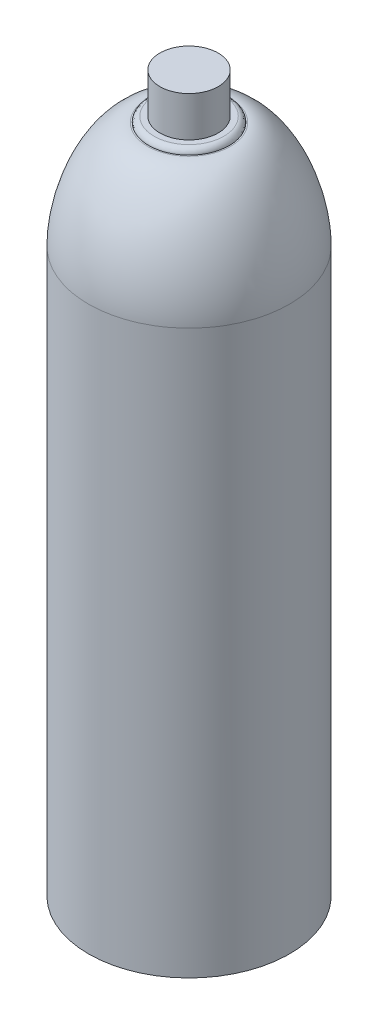
ISO-10303-21;
HEADER;
FILE_DESCRIPTION(('STEP AP214'),'2;1');
FILE_NAME('part.step','',(''),(''),'','','');
FILE_SCHEMA(('AUTOMOTIVE_DESIGN { 1 0 10303 214 1 1 1 1 }'));
ENDSEC;
DATA;
#1=APPLICATION_CONTEXT('core data for automotive mechanical design processes');
#2=APPLICATION_PROTOCOL_DEFINITION('international standard','automotive_design',2000,#1);
#3=PRODUCT_CONTEXT('',#1,'mechanical');
#4=PRODUCT('Part','Part','',(#3));
#5=PRODUCT_RELATED_PRODUCT_CATEGORY('part','',(#4));
#6=PRODUCT_DEFINITION_FORMATION('','',#4);
#7=PRODUCT_DEFINITION_CONTEXT('part definition',#1,'design');
#8=PRODUCT_DEFINITION('design','',#6,#7);
#9=PRODUCT_DEFINITION_SHAPE('','',#8);
#10=(LENGTH_UNIT() NAMED_UNIT(*) SI_UNIT(.MILLI.,.METRE.));
#11=(NAMED_UNIT(*) PLANE_ANGLE_UNIT() SI_UNIT($,.RADIAN.));
#12=(NAMED_UNIT(*) SI_UNIT($,.STERADIAN.) SOLID_ANGLE_UNIT());
#13=UNCERTAINTY_MEASURE_WITH_UNIT(LENGTH_MEASURE(1.E-05),#10,'distance_accuracy_value','');
#14=(GEOMETRIC_REPRESENTATION_CONTEXT(3) GLOBAL_UNCERTAINTY_ASSIGNED_CONTEXT((#13)) GLOBAL_UNIT_ASSIGNED_CONTEXT((#10,
#11,#12)) REPRESENTATION_CONTEXT('',''));
#15=CARTESIAN_POINT('',(0.,0.,0.));
#16=DIRECTION('',(0.,0.,1.));
#17=DIRECTION('',(1.,0.,0.));
#18=AXIS2_PLACEMENT_3D('',#15,#16,#17);
#19=CARTESIAN_POINT('',(0.,250.,0.));
#20=DIRECTION('',(0.,-1.,0.));
#21=DIRECTION('',(0.,0.,-1.));
#22=AXIS2_PLACEMENT_3D('',#19,#20,#21);
#23=CYLINDRICAL_SURFACE('',#22,37.5);
#24=CARTESIAN_POINT('',(0.,210.,37.5));
#25=CARTESIAN_POINT('',(4.90873851782908,210.,37.5));
#26=CARTESIAN_POINT('',(9.81554566661643,210.,36.5239753737598));
#27=CARTESIAN_POINT('',(18.8857117607653,210.,32.7669895645867));
#28=CARTESIAN_POINT('',(23.0455020014685,210.,29.9875065875226));
#29=CARTESIAN_POINT('',(29.9875065875226,210.,23.0455020014685));
#30=CARTESIAN_POINT('',(32.7669895645878,210.,18.8857117607628));
#31=CARTESIAN_POINT('',(36.5239753737588,210.,9.8155456666189));
#32=CARTESIAN_POINT('',(37.5,210.,4.90873851782876));
#33=CARTESIAN_POINT('',(37.5,210.,-4.90873851782875));
#34=CARTESIAN_POINT('',(36.5239753737571,210.,-9.81554566662292));
#35=CARTESIAN_POINT('',(32.7669895645894,210.,-18.8857117607588));
#36=CARTESIAN_POINT('',(29.9875065875247,210.,-23.0455020014663));
#37=CARTESIAN_POINT('',(23.0455020014663,210.,-29.9875065875248));
#38=CARTESIAN_POINT('',(18.8857117607618,210.,-32.7669895645882));
#39=CARTESIAN_POINT('',(9.81554566662007,210.,-36.5239753737583));
#40=CARTESIAN_POINT('',(4.90873851782876,210.,-37.5));
#41=CARTESIAN_POINT('',(-4.90873851782875,210.,-37.5));
#42=CARTESIAN_POINT('',(-9.81554566662147,210.,-36.5239753737577));
#43=CARTESIAN_POINT('',(-18.8857117607602,210.,-32.7669895645889));
#44=CARTESIAN_POINT('',(-23.0455020014681,210.,-29.987506587523));
#45=CARTESIAN_POINT('',(-29.987506587523,210.,-23.0455020014681));
#46=CARTESIAN_POINT('',(-32.7669895645885,210.,-18.885711760761));
#47=CARTESIAN_POINT('',(-36.523975373758,210.,-9.81554566662087));
#48=CARTESIAN_POINT('',(-37.5,210.,-4.9087385178287));
#49=CARTESIAN_POINT('',(-37.5,210.,4.90873851782882));
#50=CARTESIAN_POINT('',(-36.5239753737567,210.,9.81554566662376));
#51=CARTESIAN_POINT('',(-32.7669895645898,210.,18.8857117607579));
#52=CARTESIAN_POINT('',(-29.9875065875223,210.,23.0455020014688));
#53=CARTESIAN_POINT('',(-23.0455020014689,210.,29.9875065875222));
#54=CARTESIAN_POINT('',(-18.8857117607595,210.,32.7669895645891));
#55=CARTESIAN_POINT('',(-9.81554566662237,210.,36.5239753737573));
#56=CARTESIAN_POINT('',(-4.90873851782909,210.,37.5));
#57=CARTESIAN_POINT('',(0.,210.,37.5));
#58=(BOUNDED_CURVE() B_SPLINE_CURVE(3,(#24,#25,#26,#27,#28,#29,#30,#31,#32,#33,#34,#35,#36,#37,
#38,#39,#40,#41,#42,#43,#44,#45,#46,#47,#48,#49,#50,#51,#52,#53,#54,#55,#56,#57),.UNSPECIFIED.,
.T.,.F.) B_SPLINE_CURVE_WITH_KNOTS((4,2,2,2,2,2,2,2,2,2,2,2,2,2,2,2,4),(0.,0.392699081698724,
0.785398163397448,1.17809724509617,1.5707963267949,1.96349540849362,2.35619449019234,
2.74889357189107,3.14159265358979,3.53429173528852,3.92699081698724,4.31968989868597,
4.71238898038469,5.10508806208341,5.49778714378214,5.89048622548086,6.28318530717959),
.UNSPECIFIED.) CURVE() GEOMETRIC_REPRESENTATION_ITEM() RATIONAL_B_SPLINE_CURVE((1.,1.,1.,1.,1.,
1.,1.,1.,1.,1.,1.,1.,1.,1.,1.,1.,1.,1.,1.,1.,1.,1.,1.,1.,1.,1.,1.,1.,1.,1.,1.,1.,1.,1.)) REPRESENTATION_ITEM(''));
#59=CARTESIAN_POINT('',(0.,210.,37.5));
#60=VERTEX_POINT('',#59);
#61=EDGE_CURVE('E56',#60,#60,#58,.F.);
#62=ORIENTED_EDGE('',*,*,#61,.T.);
#63=EDGE_LOOP('',(#62));
#64=FACE_BOUND('',#63,.T.);
#65=CARTESIAN_POINT('',(0.,0.,0.));
#66=DIRECTION('',(0.,1.,0.));
#67=DIRECTION('',(0.,0.,1.));
#68=AXIS2_PLACEMENT_3D('',#65,#66,#67);
#69=CIRCLE('',#68,37.5);
#70=CARTESIAN_POINT('',(0.,0.,37.5));
#71=VERTEX_POINT('',#70);
#72=EDGE_CURVE('E71',#71,#71,#69,.T.);
#73=ORIENTED_EDGE('',*,*,#72,.T.);
#74=EDGE_LOOP('',(#73));
#75=FACE_BOUND('',#74,.T.);
#76=ADVANCED_FACE('F42',(#64,#75),#23,.T.);
#77=CARTESIAN_POINT('',(0.,250.,0.));
#78=DIRECTION('',(0.,1.,0.));
#79=DIRECTION('',(0.,0.,1.));
#80=AXIS2_PLACEMENT_3D('',#77,#78,#79);
#81=PLANE('',#80);
#82=CARTESIAN_POINT('',(0.,250.,15.5));
#83=CARTESIAN_POINT('',(-2.02894525403602,250.,15.5));
#84=CARTESIAN_POINT('',(-4.05709220886935,250.,15.0965764878189));
#85=CARTESIAN_POINT('',(-7.80609419444848,250.,13.543689020031));
#86=CARTESIAN_POINT('',(-9.52547416060783,250.,12.3948360561752));
#87=CARTESIAN_POINT('',(-12.3948360561752,250.,9.52547416060777));
#88=CARTESIAN_POINT('',(-13.5436890200293,250.,7.80609419444756));
#89=CARTESIAN_POINT('',(-15.0965764878207,250.,4.05709220887018));
#90=CARTESIAN_POINT('',(-15.5,250.,2.02894525403591));
#91=CARTESIAN_POINT('',(-15.5,250.,-2.02894525403586));
#92=CARTESIAN_POINT('',(-15.0965764878206,250.,-4.05709220886935));
#93=CARTESIAN_POINT('',(-13.5436890200292,250.,-7.80609419444848));
#94=CARTESIAN_POINT('',(-12.3948360561759,250.,-9.52547416060711));
#95=CARTESIAN_POINT('',(-9.52547416060712,250.,-12.3948360561759));
#96=CARTESIAN_POINT('',(-7.80609419444786,250.,-13.5436890200293));
#97=CARTESIAN_POINT('',(-4.05709220886989,250.,-15.0965764878206));
#98=CARTESIAN_POINT('',(-2.02894525403588,250.,-15.5));
#99=CARTESIAN_POINT('',(2.02894525403589,250.,-15.5));
#100=CARTESIAN_POINT('',(4.05709220886905,250.,-15.0965764878206));
#101=CARTESIAN_POINT('',(7.80609419444878,250.,-13.5436890200293));
#102=CARTESIAN_POINT('',(9.52547416060711,250.,-12.3948360561776));
#103=CARTESIAN_POINT('',(12.3948360561759,250.,-9.52547416060537));
#104=CARTESIAN_POINT('',(13.5436890200302,250.,-7.80609419444817));
#105=CARTESIAN_POINT('',(15.0965764878197,250.,-4.05709220886962));
#106=CARTESIAN_POINT('',(15.5,250.,-2.02894525403588));
#107=CARTESIAN_POINT('',(15.5,250.,2.02894525403589));
#108=CARTESIAN_POINT('',(15.0965764878215,250.,4.05709220886961));
#109=CARTESIAN_POINT('',(13.5436890200284,250.,7.80609419444816));
#110=CARTESIAN_POINT('',(12.3948360561755,250.,9.52547416060746));
#111=CARTESIAN_POINT('',(9.52547416060746,250.,12.3948360561755));
#112=CARTESIAN_POINT('',(7.80609419444905,250.,13.5436890200284));
#113=CARTESIAN_POINT('',(4.05709220886874,250.,15.0965764878215));
#114=CARTESIAN_POINT('',(2.02894525403602,250.,15.5));
#115=CARTESIAN_POINT('',(0.,250.,15.5));
#116=(BOUNDED_CURVE() B_SPLINE_CURVE(3,(#82,#83,#84,#85,#86,#87,#88,#89,#90,#91,#92,#93,#94,#95,
#96,#97,#98,#99,#100,#101,#102,#103,#104,#105,#106,#107,#108,#109,#110,#111,#112,#113,#114,
#115),.UNSPECIFIED.,.T.,.F.) B_SPLINE_CURVE_WITH_KNOTS((4,2,2,2,2,2,2,2,2,2,2,2,2,2,2,2,4),(0.,
0.392699081698725,0.785398163397448,1.17809724509617,1.5707963267949,1.96349540849362,
2.35619449019234,2.74889357189107,3.14159265358979,3.53429173528852,3.92699081698724,
4.31968989868597,4.71238898038469,5.10508806208341,5.49778714378214,5.89048622548086,
6.28318530717959),
.UNSPECIFIED.) CURVE() GEOMETRIC_REPRESENTATION_ITEM() RATIONAL_B_SPLINE_CURVE((1.,1.,1.,1.,1.,
1.,1.,1.,1.,1.,1.,1.,1.,1.,1.,1.,1.,1.,1.,1.,1.,1.,1.,1.,1.,1.,1.,1.,1.,1.,1.,1.,1.,1.)) REPRESENTATION_ITEM(''));
#117=CARTESIAN_POINT('',(0.,250.,15.5));
#118=VERTEX_POINT('',#117);
#119=EDGE_CURVE('E61',#118,#118,#116,.F.);
#120=ORIENTED_EDGE('',*,*,#119,.T.);
#121=EDGE_LOOP('',(#120));
#122=FACE_BOUND('',#121,.T.);
#123=CARTESIAN_POINT('',(0.,250.,15.));
#124=CARTESIAN_POINT('',(1.9634954065633,250.,15.));
#125=CARTESIAN_POINT('',(3.92621826717784,250.,14.6095901492839));
#126=CARTESIAN_POINT('',(7.55428470377486,250.,13.1067958260547));
#127=CARTESIAN_POINT('',(9.21820080099195,250.,11.9950026346045));
#128=CARTESIAN_POINT('',(11.9950026346045,250.,9.21820080099195));
#129=CARTESIAN_POINT('',(13.1067958260547,250.,7.55428470377496));
#130=CARTESIAN_POINT('',(14.6095901492839,250.,3.92621826717772));
#131=CARTESIAN_POINT('',(15.,250.,1.96349540655724));
#132=CARTESIAN_POINT('',(15.,250.,-1.96349540655723));
#133=CARTESIAN_POINT('',(14.6095901492839,250.,-3.92621826717784));
#134=CARTESIAN_POINT('',(13.1067958260547,250.,-7.55428470377486));
#135=CARTESIAN_POINT('',(11.9950026346055,250.,-9.2182008009909));
#136=CARTESIAN_POINT('',(9.21820080099088,250.,-11.9950026346055));
#137=CARTESIAN_POINT('',(7.55428470377403,250.,-13.1067958260551));
#138=CARTESIAN_POINT('',(3.92621826717871,250.,-14.6095901492835));
#139=CARTESIAN_POINT('',(1.96349540655724,250.,-15.));
#140=CARTESIAN_POINT('',(-1.96349540655723,250.,-15.));
#141=CARTESIAN_POINT('',(-3.92621826717803,250.,-14.6095901492838));
#142=CARTESIAN_POINT('',(-7.55428470377462,250.,-13.1067958260548));
#143=CARTESIAN_POINT('',(-9.21820080099237,250.,-11.9950026346041));
#144=CARTESIAN_POINT('',(-11.9950026346041,250.,-9.21820080099236));
#145=CARTESIAN_POINT('',(-13.1067958260548,250.,-7.55428470377467));
#146=CARTESIAN_POINT('',(-14.6095901492838,250.,-3.92621826717806));
#147=CARTESIAN_POINT('',(-15.,250.,-1.96349540655721));
#148=CARTESIAN_POINT('',(-15.,250.,1.96349540655726));
#149=CARTESIAN_POINT('',(-14.609590149284,250.,3.9262182671776));
#150=CARTESIAN_POINT('',(-13.1067958260547,250.,7.55428470377505));
#151=CARTESIAN_POINT('',(-11.995002634602,250.,9.21820080099444));
#152=CARTESIAN_POINT('',(-9.21820080099451,250.,11.9950026346019));
#153=CARTESIAN_POINT('',(-7.55428470377405,250.,13.1067958260551));
#154=CARTESIAN_POINT('',(-3.92621826717869,250.,14.6095901492835));
#155=CARTESIAN_POINT('',(-1.96349540656331,250.,15.));
#156=CARTESIAN_POINT('',(0.,250.,15.));
#157=(BOUNDED_CURVE() B_SPLINE_CURVE(3,(#123,#124,#125,#126,#127,#128,#129,#130,#131,#132,#133,
#134,#135,#136,#137,#138,#139,#140,#141,#142,#143,#144,#145,#146,#147,#148,#149,#150,#151,#152,
#153,#154,#155,#156),.UNSPECIFIED.,.T.,.F.) B_SPLINE_CURVE_WITH_KNOTS((4,2,2,2,2,2,2,2,2,2,2,2,
2,2,2,2,4),(0.,0.392699081698724,0.785398163397448,1.17809724509617,1.5707963267949,
1.96349540849362,2.35619449019234,2.74889357189107,3.14159265358979,3.53429173528852,
3.92699081698724,4.31968989868597,4.71238898038469,5.10508806208341,5.49778714378214,
5.89048622548086,6.28318530717959),
.UNSPECIFIED.) CURVE() GEOMETRIC_REPRESENTATION_ITEM() RATIONAL_B_SPLINE_CURVE((1.,1.,1.,1.,1.,
1.,1.,1.,1.,1.,1.,1.,1.,1.,1.,1.,1.,1.,1.,1.,1.,1.,1.,1.,1.,1.,1.,1.,1.,1.,1.,1.,1.,1.)) REPRESENTATION_ITEM(''));
#158=CARTESIAN_POINT('',(0.,250.,15.));
#159=VERTEX_POINT('',#158);
#160=EDGE_CURVE('E66',#159,#159,#157,.T.);
#161=ORIENTED_EDGE('',*,*,#160,.F.);
#162=EDGE_LOOP('',(#161));
#163=FACE_BOUND('',#162,.T.);
#164=ADVANCED_FACE('F88',(#122,#163),#81,.T.);
#165=CARTESIAN_POINT('',(0.,0.,0.));
#166=DIRECTION('',(0.,1.,0.));
#167=DIRECTION('',(0.,0.,1.));
#168=AXIS2_PLACEMENT_3D('',#165,#166,#167);
#169=PLANE('',#168);
#170=ORIENTED_EDGE('',*,*,#72,.F.);
#171=EDGE_LOOP('',(#170));
#172=FACE_BOUND('',#171,.T.);
#173=ADVANCED_FACE('F98',(#172),#169,.F.);
#174=CARTESIAN_POINT('',(0.,252.,0.));
#175=DIRECTION('',(0.,1.,0.));
#176=DIRECTION('',(0.,0.,1.));
#177=AXIS2_PLACEMENT_3D('',#174,#175,#176);
#178=PLANE('',#177);
#179=CARTESIAN_POINT('',(0.,252.,13.));
#180=CARTESIAN_POINT('',(-1.70169601902153,252.,13.0000000000015));
#181=CARTESIAN_POINT('',(-3.4027224982213,252.,12.6616447960449));
#182=CARTESIAN_POINT('',(-6.54704674327107,252.,11.3592230492486));
#183=CARTESIAN_POINT('',(-7.98910736086171,252.,10.3956689499885));
#184=CARTESIAN_POINT('',(-10.3956689499886,252.,7.98910736086166));
#185=CARTESIAN_POINT('',(-11.3592230492456,252.,6.54704674327103));
#186=CARTESIAN_POINT('',(-12.6616447960478,252.,3.40272249822126));
#187=CARTESIAN_POINT('',(-13.,252.,1.70169601901629));
#188=CARTESIAN_POINT('',(-13.,252.,-1.70169601901625));
#189=CARTESIAN_POINT('',(-12.6616447960449,252.,-3.40272249822056));
#190=CARTESIAN_POINT('',(-11.3592230492486,252.,-6.54704674327181));
#191=CARTESIAN_POINT('',(-10.3956689499896,252.,-7.98910736086064));
#192=CARTESIAN_POINT('',(-7.98910736086065,252.,-10.3956689499896));
#193=CARTESIAN_POINT('',(-6.54704674327126,252.,-11.3592230492478));
#194=CARTESIAN_POINT('',(-3.40272249822104,252.,-12.6616447960457));
#195=CARTESIAN_POINT('',(-1.70169601901627,252.,-13.));
#196=CARTESIAN_POINT('',(1.70169601901627,252.,-13.));
#197=CARTESIAN_POINT('',(3.40272249822108,252.,-12.6616447960457));
#198=CARTESIAN_POINT('',(6.54704674327129,252.,-11.3592230492478));
#199=CARTESIAN_POINT('',(7.98910736085916,252.,-10.3956689499911));
#200=CARTESIAN_POINT('',(10.3956689499911,252.,-7.98910736085917));
#201=CARTESIAN_POINT('',(11.3592230492467,252.,-6.54704674327117));
#202=CARTESIAN_POINT('',(12.6616447960468,252.,-3.40272249822117));
#203=CARTESIAN_POINT('',(13.,252.,-1.70169601901627));
#204=CARTESIAN_POINT('',(13.,252.,1.70169601901627));
#205=CARTESIAN_POINT('',(12.6616447960453,252.,3.40272249822043));
#206=CARTESIAN_POINT('',(11.3592230492482,252.,6.5470467432719));
#207=CARTESIAN_POINT('',(10.3956689499906,252.,7.98910736085969));
#208=CARTESIAN_POINT('',(7.98910736085969,252.,10.3956689499906));
#209=CARTESIAN_POINT('',(6.54704674327117,252.,11.3592230492467));
#210=CARTESIAN_POINT('',(3.40272249822117,252.,12.6616447960468));
#211=CARTESIAN_POINT('',(1.70169601902153,252.,12.9999999999985));
#212=CARTESIAN_POINT('',(0.,252.,13.));
#213=(BOUNDED_CURVE() B_SPLINE_CURVE(3,(#179,#180,#181,#182,#183,#184,#185,#186,#187,#188,#189,
#190,#191,#192,#193,#194,#195,#196,#197,#198,#199,#200,#201,#202,#203,#204,#205,#206,#207,#208,
#209,#210,#211,#212),.UNSPECIFIED.,.T.,.F.) B_SPLINE_CURVE_WITH_KNOTS((4,2,2,2,2,2,2,2,2,2,2,2,
2,2,2,2,4),(0.,0.392699081698725,0.785398163397448,1.17809724509617,1.5707963267949,
1.96349540849362,2.35619449019234,2.74889357189107,3.14159265358979,3.53429173528852,
3.92699081698724,4.31968989868597,4.71238898038469,5.10508806208341,5.49778714378214,
5.89048622548086,6.28318530717959),
.UNSPECIFIED.) CURVE() GEOMETRIC_REPRESENTATION_ITEM() RATIONAL_B_SPLINE_CURVE((1.,1.,1.,1.,1.,
1.,1.,1.,1.,1.,1.,1.,1.,1.,1.,1.,1.,1.,1.,1.,1.,1.,1.,1.,1.,1.,1.,1.,1.,1.,1.,1.,1.,1.)) REPRESENTATION_ITEM(''));
#214=CARTESIAN_POINT('',(0.,252.,13.));
#215=VERTEX_POINT('',#214);
#216=EDGE_CURVE('E11',#215,#215,#213,.F.);
#217=ORIENTED_EDGE('',*,*,#216,.T.);
#218=EDGE_LOOP('',(#217));
#219=FACE_BOUND('',#218,.T.);
#220=CARTESIAN_POINT('',(0.,252.,0.));
#221=DIRECTION('',(0.,1.,0.));
#222=DIRECTION('',(0.,0.,1.));
#223=AXIS2_PLACEMENT_3D('',#220,#221,#222);
#224=CIRCLE('',#223,10.875);
#225=CARTESIAN_POINT('',(0.,252.,10.875));
#226=VERTEX_POINT('',#225);
#227=EDGE_CURVE('E76',#226,#226,#224,.F.);
#228=ORIENTED_EDGE('',*,*,#227,.T.);
#229=EDGE_LOOP('',(#228));
#230=FACE_BOUND('',#229,.T.);
#231=ADVANCED_FACE('F99',(#219,#230),#178,.T.);
#232=CARTESIAN_POINT('',(0.,267.,0.));
#233=DIRECTION('',(0.,-1.,0.));
#234=DIRECTION('',(0.,0.,-1.));
#235=AXIS2_PLACEMENT_3D('',#232,#233,#234);
#236=CYLINDRICAL_SURFACE('',#235,10.875);
#237=ORIENTED_EDGE('',*,*,#227,.F.);
#238=EDGE_LOOP('',(#237));
#239=FACE_BOUND('',#238,.T.);
#240=CARTESIAN_POINT('',(0.,267.,0.));
#241=DIRECTION('',(0.,1.,0.));
#242=DIRECTION('',(0.,0.,1.));
#243=AXIS2_PLACEMENT_3D('',#240,#241,#242);
#244=CIRCLE('',#243,10.875);
#245=CARTESIAN_POINT('',(0.,267.,10.875));
#246=VERTEX_POINT('',#245);
#247=EDGE_CURVE('E81',#246,#246,#244,.T.);
#248=ORIENTED_EDGE('',*,*,#247,.F.);
#249=EDGE_LOOP('',(#248));
#250=FACE_BOUND('',#249,.T.);
#251=ADVANCED_FACE('F175',(#239,#250),#236,.T.);
#252=CARTESIAN_POINT('',(0.,267.,0.));
#253=DIRECTION('',(0.,1.,0.));
#254=DIRECTION('',(0.,0.,1.));
#255=AXIS2_PLACEMENT_3D('',#252,#253,#254);
#256=PLANE('',#255);
#257=ORIENTED_EDGE('',*,*,#247,.T.);
#258=EDGE_LOOP('',(#257));
#259=FACE_BOUND('',#258,.T.);
#260=ADVANCED_FACE('F171',(#259),#256,.T.);
#261=CARTESIAN_POINT('',(0.,250.,15.5));
#262=CARTESIAN_POINT('',(2.02894525403602,250.,15.5));
#263=CARTESIAN_POINT('',(4.05709220886874,250.,15.0965764878215));
#264=CARTESIAN_POINT('',(7.80609419444905,250.,13.5436890200284));
#265=CARTESIAN_POINT('',(9.52547416060746,250.,12.3948360561755));
#266=CARTESIAN_POINT('',(12.3948360561755,250.,9.52547416060746));
#267=CARTESIAN_POINT('',(13.5436890200284,250.,7.80609419444816));
#268=CARTESIAN_POINT('',(15.0965764878215,250.,4.05709220886961));
#269=CARTESIAN_POINT('',(15.5,250.,2.02894525403589));
#270=CARTESIAN_POINT('',(15.5,250.,-2.02894525403588));
#271=CARTESIAN_POINT('',(15.0965764878197,250.,-4.05709220886962));
#272=CARTESIAN_POINT('',(13.5436890200302,250.,-7.80609419444817));
#273=CARTESIAN_POINT('',(12.3948360561759,250.,-9.52547416060537));
#274=CARTESIAN_POINT('',(9.52547416060711,250.,-12.3948360561776));
#275=CARTESIAN_POINT('',(7.80609419444878,250.,-13.5436890200293));
#276=CARTESIAN_POINT('',(4.05709220886905,250.,-15.0965764878206));
#277=CARTESIAN_POINT('',(2.02894525403589,250.,-15.5));
#278=CARTESIAN_POINT('',(-2.02894525403588,250.,-15.5));
#279=CARTESIAN_POINT('',(-4.05709220886989,250.,-15.0965764878206));
#280=CARTESIAN_POINT('',(-7.80609419444786,250.,-13.5436890200293));
#281=CARTESIAN_POINT('',(-9.52547416060712,250.,-12.3948360561759));
#282=CARTESIAN_POINT('',(-12.3948360561759,250.,-9.52547416060711));
#283=CARTESIAN_POINT('',(-13.5436890200292,250.,-7.80609419444848));
#284=CARTESIAN_POINT('',(-15.0965764878206,250.,-4.05709220886935));
#285=CARTESIAN_POINT('',(-15.5,250.,-2.02894525403586));
#286=CARTESIAN_POINT('',(-15.5,250.,2.02894525403591));
#287=CARTESIAN_POINT('',(-15.0965764878207,250.,4.05709220887018));
#288=CARTESIAN_POINT('',(-13.5436890200293,250.,7.80609419444756));
#289=CARTESIAN_POINT('',(-12.3948360561752,250.,9.52547416060777));
#290=CARTESIAN_POINT('',(-9.52547416060783,250.,12.3948360561752));
#291=CARTESIAN_POINT('',(-7.80609419444848,250.,13.543689020031));
#292=CARTESIAN_POINT('',(-4.05709220886935,250.,15.0965764878189));
#293=CARTESIAN_POINT('',(-2.02894525403602,250.,15.5));
#294=CARTESIAN_POINT('',(0.,250.,15.5));
#295=CARTESIAN_POINT('',(0.,250.,37.5));
#296=CARTESIAN_POINT('',(4.90873851782908,250.,37.5));
#297=CARTESIAN_POINT('',(9.81554566661408,250.,36.5239753737556));
#298=CARTESIAN_POINT('',(18.8857117607677,250.,32.7669895645909));
#299=CARTESIAN_POINT('',(23.0455020014649,250.,29.9875065875261));
#300=CARTESIAN_POINT('',(29.9875065875261,250.,23.0455020014649));
#301=CARTESIAN_POINT('',(32.7669895645909,250.,18.8857117607641));
#302=CARTESIAN_POINT('',(36.5239753737556,250.,9.81554566661759));
#303=CARTESIAN_POINT('',(37.5,250.,4.90873851782876));
#304=CARTESIAN_POINT('',(37.5,250.,-4.90873851782875));
#305=CARTESIAN_POINT('',(36.5239753737486,250.,-9.81554566661937));
#306=CARTESIAN_POINT('',(32.766989564598,250.,-18.8857117607624));
#307=CARTESIAN_POINT('',(29.9875065875247,250.,-23.0455020014663));
#308=CARTESIAN_POINT('',(23.0455020014663,250.,-29.9875065875248));
#309=CARTESIAN_POINT('',(18.8857117607644,250.,-32.7669895645833));
#310=CARTESIAN_POINT('',(9.81554566661742,250.,-36.5239753737632));
#311=CARTESIAN_POINT('',(4.90873851782876,250.,-37.5));
#312=CARTESIAN_POINT('',(-4.90873851782875,250.,-37.5));
#313=CARTESIAN_POINT('',(-9.81554566661908,250.,-36.5239753737491));
#314=CARTESIAN_POINT('',(-18.8857117607626,250.,-32.7669895645974));
#315=CARTESIAN_POINT('',(-23.0455020014699,250.,-29.9875065875247));
#316=CARTESIAN_POINT('',(-29.9875065875212,250.,-23.0455020014663));
#317=CARTESIAN_POINT('',(-32.7669895645915,250.,-18.8857117607587));
#318=CARTESIAN_POINT('',(-36.523975373755,250.,-9.81554566662316));
#319=CARTESIAN_POINT('',(-37.5,250.,-4.9087385178287));
#320=CARTESIAN_POINT('',(-37.5,250.,4.90873851782882));
#321=CARTESIAN_POINT('',(-36.523975373755,250.,9.81554566662305));
#322=CARTESIAN_POINT('',(-32.7669895645915,250.,18.8857117607586));
#323=CARTESIAN_POINT('',(-29.9875065875206,250.,23.0455020014705));
#324=CARTESIAN_POINT('',(-23.0455020014707,250.,29.9875065875204));
#325=CARTESIAN_POINT('',(-18.8857117607587,250.,32.7669895645915));
#326=CARTESIAN_POINT('',(-9.81554566662316,250.,36.523975373755));
#327=CARTESIAN_POINT('',(-4.90873851782909,250.,37.5));
#328=CARTESIAN_POINT('',(0.,250.,37.5));
#329=CARTESIAN_POINT('',(0.,210.,37.5));
#330=CARTESIAN_POINT('',(4.90873851782908,210.,37.5));
#331=CARTESIAN_POINT('',(9.81554566661643,210.,36.5239753737598));
#332=CARTESIAN_POINT('',(18.8857117607653,210.,32.7669895645867));
#333=CARTESIAN_POINT('',(23.0455020014685,210.,29.9875065875226));
#334=CARTESIAN_POINT('',(29.9875065875226,210.,23.0455020014685));
#335=CARTESIAN_POINT('',(32.7669895645878,210.,18.8857117607628));
#336=CARTESIAN_POINT('',(36.5239753737588,210.,9.8155456666189));
#337=CARTESIAN_POINT('',(37.5,210.,4.90873851782876));
#338=CARTESIAN_POINT('',(37.5,210.,-4.90873851782875));
#339=CARTESIAN_POINT('',(36.5239753737571,210.,-9.81554566662292));
#340=CARTESIAN_POINT('',(32.7669895645894,210.,-18.8857117607588));
#341=CARTESIAN_POINT('',(29.9875065875247,210.,-23.0455020014663));
#342=CARTESIAN_POINT('',(23.0455020014663,210.,-29.9875065875248));
#343=CARTESIAN_POINT('',(18.8857117607618,210.,-32.7669895645882));
#344=CARTESIAN_POINT('',(9.81554566662007,210.,-36.5239753737583));
#345=CARTESIAN_POINT('',(4.90873851782876,210.,-37.5));
#346=CARTESIAN_POINT('',(-4.90873851782875,210.,-37.5));
#347=CARTESIAN_POINT('',(-9.81554566662147,210.,-36.5239753737577));
#348=CARTESIAN_POINT('',(-18.8857117607602,210.,-32.7669895645889));
#349=CARTESIAN_POINT('',(-23.0455020014681,210.,-29.987506587523));
#350=CARTESIAN_POINT('',(-29.987506587523,210.,-23.0455020014681));
#351=CARTESIAN_POINT('',(-32.7669895645885,210.,-18.885711760761));
#352=CARTESIAN_POINT('',(-36.523975373758,210.,-9.81554566662087));
#353=CARTESIAN_POINT('',(-37.5,210.,-4.9087385178287));
#354=CARTESIAN_POINT('',(-37.5,210.,4.90873851782882));
#355=CARTESIAN_POINT('',(-36.5239753737567,210.,9.81554566662376));
#356=CARTESIAN_POINT('',(-32.7669895645898,210.,18.8857117607579));
#357=CARTESIAN_POINT('',(-29.9875065875223,210.,23.0455020014688));
#358=CARTESIAN_POINT('',(-23.0455020014689,210.,29.9875065875222));
#359=CARTESIAN_POINT('',(-18.8857117607595,210.,32.7669895645891));
#360=CARTESIAN_POINT('',(-9.81554566662237,210.,36.5239753737573));
#361=CARTESIAN_POINT('',(-4.90873851782909,210.,37.5));
#362=CARTESIAN_POINT('',(0.,210.,37.5));
#363=(BOUNDED_SURFACE() B_SPLINE_SURFACE(2,3,((#261,#262,#263,#264,#265,#266,#267,#268,#269,
#270,#271,#272,#273,#274,#275,#276,#277,#278,#279,#280,#281,#282,#283,#284,#285,#286,#287,#288,
#289,#290,#291,#292,#293,#294),(#295,#296,#297,#298,#299,#300,#301,#302,#303,#304,#305,#306,
#307,#308,#309,#310,#311,#312,#313,#314,#315,#316,#317,#318,#319,#320,#321,#322,#323,#324,#325,
#326,#327,#328),(#329,#330,#331,#332,#333,#334,#335,#336,#337,#338,#339,#340,#341,#342,#343,
#344,#345,#346,#347,#348,#349,#350,#351,#352,#353,#354,#355,#356,#357,#358,#359,#360,#361,
#362)),.UNSPECIFIED.,.F.,.T.,.F.) B_SPLINE_SURFACE_WITH_KNOTS((3,3),(4,2,2,2,2,2,2,2,2,2,2,2,2,
2,2,2,4),(0.,1.),(0.,0.392699081698724,0.785398163397448,1.17809724509617,1.5707963267949,
1.96349540849362,2.35619449019234,2.74889357189107,3.14159265358979,3.53429173528852,
3.92699081698724,4.31968989868597,4.71238898038469,5.10508806208341,5.49778714378214,
5.89048622548086,6.28318530717959),
.UNSPECIFIED.) GEOMETRIC_REPRESENTATION_ITEM() RATIONAL_B_SPLINE_SURFACE(((1.,1.,1.,1.,1.,1.,1.,
1.,1.,1.,1.,1.,1.,1.,1.,1.,1.,1.,1.,1.,1.,1.,1.,1.,1.,1.,1.,1.,1.,1.,1.,1.,1.,1.),
(0.538461538461539,0.538461538461539,0.538461538461539,0.538461538461539,0.538461538461539,
0.538461538461539,0.538461538461538,0.538461538461538,0.538461538461539,0.538461538461539,
0.538461538461539,0.538461538461539,0.538461538461539,0.538461538461539,0.538461538461538,
0.538461538461538,0.538461538461539,0.538461538461539,0.538461538461539,0.538461538461539,
0.538461538461539,0.538461538461539,0.538461538461539,0.538461538461539,0.538461538461539,
0.538461538461539,0.538461538461539,0.538461538461539,0.538461538461539,0.538461538461539,
0.538461538461538,0.538461538461538,0.538461538461539,0.538461538461539),(1.,1.,1.,1.,1.,1.,1.,
1.,1.,1.,1.,1.,1.,1.,1.,1.,1.,1.,1.,1.,1.,1.,1.,1.,1.,1.,1.,1.,1.,1.,1.,1.,1.,1.))) REPRESENTATION_ITEM('') SURFACE());
#364=ORIENTED_EDGE('',*,*,#61,.F.);
#365=EDGE_LOOP('',(#364));
#366=FACE_BOUND('',#365,.T.);
#367=ORIENTED_EDGE('',*,*,#119,.F.);
#368=EDGE_LOOP('',(#367));
#369=FACE_BOUND('',#368,.T.);
#370=ADVANCED_FACE('F109',(#366,#369),#363,.T.);
#371=CARTESIAN_POINT('',(0.,252.,13.));
#372=CARTESIAN_POINT('',(1.70169601902153,252.,12.9999999999985));
#373=CARTESIAN_POINT('',(3.40272249822117,252.,12.6616447960468));
#374=CARTESIAN_POINT('',(6.54704674327117,252.,11.3592230492467));
#375=CARTESIAN_POINT('',(7.98910736085969,252.,10.3956689499906));
#376=CARTESIAN_POINT('',(10.3956689499906,252.,7.98910736085969));
#377=CARTESIAN_POINT('',(11.3592230492482,252.,6.5470467432719));
#378=CARTESIAN_POINT('',(12.6616447960453,252.,3.40272249822043));
#379=CARTESIAN_POINT('',(13.,252.,1.70169601901627));
#380=CARTESIAN_POINT('',(13.,252.,-1.70169601901627));
#381=CARTESIAN_POINT('',(12.6616447960468,252.,-3.40272249822117));
#382=CARTESIAN_POINT('',(11.3592230492467,252.,-6.54704674327117));
#383=CARTESIAN_POINT('',(10.3956689499911,252.,-7.98910736085917));
#384=CARTESIAN_POINT('',(7.98910736085916,252.,-10.3956689499911));
#385=CARTESIAN_POINT('',(6.54704674327129,252.,-11.3592230492478));
#386=CARTESIAN_POINT('',(3.40272249822108,252.,-12.6616447960457));
#387=CARTESIAN_POINT('',(1.70169601901627,252.,-13.));
#388=CARTESIAN_POINT('',(-1.70169601901627,252.,-13.));
#389=CARTESIAN_POINT('',(-3.40272249822104,252.,-12.6616447960457));
#390=CARTESIAN_POINT('',(-6.54704674327126,252.,-11.3592230492478));
#391=CARTESIAN_POINT('',(-7.98910736086065,252.,-10.3956689499896));
#392=CARTESIAN_POINT('',(-10.3956689499896,252.,-7.98910736086064));
#393=CARTESIAN_POINT('',(-11.3592230492486,252.,-6.54704674327181));
#394=CARTESIAN_POINT('',(-12.6616447960449,252.,-3.40272249822056));
#395=CARTESIAN_POINT('',(-13.,252.,-1.70169601901625));
#396=CARTESIAN_POINT('',(-13.,252.,1.70169601901629));
#397=CARTESIAN_POINT('',(-12.6616447960478,252.,3.40272249822126));
#398=CARTESIAN_POINT('',(-11.3592230492456,252.,6.54704674327103));
#399=CARTESIAN_POINT('',(-10.3956689499886,252.,7.98910736086166));
#400=CARTESIAN_POINT('',(-7.98910736086171,252.,10.3956689499885));
#401=CARTESIAN_POINT('',(-6.54704674327107,252.,11.3592230492486));
#402=CARTESIAN_POINT('',(-3.4027224982213,252.,12.6616447960449));
#403=CARTESIAN_POINT('',(-1.70169601902153,252.,13.0000000000015));
#404=CARTESIAN_POINT('',(0.,252.,13.));
#405=CARTESIAN_POINT('',(0.,252.,15.));
#406=CARTESIAN_POINT('',(1.9634954065633,252.,15.));
#407=CARTESIAN_POINT('',(3.9262182671781,252.,14.6095901492845));
#408=CARTESIAN_POINT('',(7.55428470377459,252.,13.1067958260541));
#409=CARTESIAN_POINT('',(9.21820080099195,252.,11.9950026346045));
#410=CARTESIAN_POINT('',(11.9950026346045,252.,9.21820080099195));
#411=CARTESIAN_POINT('',(13.1067958260556,252.,7.55428470377532));
#412=CARTESIAN_POINT('',(14.609590149283,252.,3.92621826717736));
#413=CARTESIAN_POINT('',(15.,252.,1.96349540655724));
#414=CARTESIAN_POINT('',(15.,252.,-1.96349540655723));
#415=CARTESIAN_POINT('',(14.6095901492845,252.,-3.92621826717884));
#416=CARTESIAN_POINT('',(13.1067958260541,252.,-7.55428470377386));
#417=CARTESIAN_POINT('',(11.9950026346055,252.,-9.2182008009909));
#418=CARTESIAN_POINT('',(9.21820080099088,252.,-11.9950026346055));
#419=CARTESIAN_POINT('',(7.55428470377468,252.,-13.1067958260549));
#420=CARTESIAN_POINT('',(3.92621826717805,252.,-14.6095901492837));
#421=CARTESIAN_POINT('',(1.96349540655724,252.,-15.));
#422=CARTESIAN_POINT('',(-1.96349540655723,252.,-15.));
#423=CARTESIAN_POINT('',(-3.92621826717727,252.,-14.6095901492837));
#424=CARTESIAN_POINT('',(-7.55428470377538,252.,-13.1067958260549));
#425=CARTESIAN_POINT('',(-9.21820080099237,252.,-11.9950026346041));
#426=CARTESIAN_POINT('',(-11.9950026346041,252.,-9.21820080099236));
#427=CARTESIAN_POINT('',(-13.1067958260563,252.,-7.55428470377675));
#428=CARTESIAN_POINT('',(-14.6095901492823,252.,-3.92621826717598));
#429=CARTESIAN_POINT('',(-15.,252.,-1.96349540655721));
#430=CARTESIAN_POINT('',(-15.,252.,1.96349540655726));
#431=CARTESIAN_POINT('',(-14.6095901492853,252.,3.92621826717741));
#432=CARTESIAN_POINT('',(-13.1067958260533,252.,7.55428470377523));
#433=CARTESIAN_POINT('',(-11.995002634602,252.,9.21820080099445));
#434=CARTESIAN_POINT('',(-9.21820080099451,252.,11.9950026346019));
#435=CARTESIAN_POINT('',(-7.55428470377602,252.,13.1067958260563));
#436=CARTESIAN_POINT('',(-3.92621826717672,252.,14.6095901492823));
#437=CARTESIAN_POINT('',(-1.96349540656331,252.,15.));
#438=CARTESIAN_POINT('',(0.,252.,15.));
#439=CARTESIAN_POINT('',(0.,250.,15.));
#440=CARTESIAN_POINT('',(1.9634954065633,250.,15.));
#441=CARTESIAN_POINT('',(3.92621826717784,250.,14.6095901492839));
#442=CARTESIAN_POINT('',(7.55428470377486,250.,13.1067958260547));
#443=CARTESIAN_POINT('',(9.21820080099195,250.,11.9950026346045));
#444=CARTESIAN_POINT('',(11.9950026346045,250.,9.21820080099195));
#445=CARTESIAN_POINT('',(13.1067958260547,250.,7.55428470377496));
#446=CARTESIAN_POINT('',(14.6095901492839,250.,3.92621826717772));
#447=CARTESIAN_POINT('',(15.,250.,1.96349540655724));
#448=CARTESIAN_POINT('',(15.,250.,-1.96349540655723));
#449=CARTESIAN_POINT('',(14.6095901492839,250.,-3.92621826717784));
#450=CARTESIAN_POINT('',(13.1067958260547,250.,-7.55428470377486));
#451=CARTESIAN_POINT('',(11.9950026346055,250.,-9.2182008009909));
#452=CARTESIAN_POINT('',(9.21820080099088,250.,-11.9950026346055));
#453=CARTESIAN_POINT('',(7.55428470377403,250.,-13.1067958260551));
#454=CARTESIAN_POINT('',(3.92621826717871,250.,-14.6095901492835));
#455=CARTESIAN_POINT('',(1.96349540655724,250.,-15.));
#456=CARTESIAN_POINT('',(-1.96349540655723,250.,-15.));
#457=CARTESIAN_POINT('',(-3.92621826717803,250.,-14.6095901492838));
#458=CARTESIAN_POINT('',(-7.55428470377462,250.,-13.1067958260548));
#459=CARTESIAN_POINT('',(-9.21820080099237,250.,-11.9950026346041));
#460=CARTESIAN_POINT('',(-11.9950026346041,250.,-9.21820080099236));
#461=CARTESIAN_POINT('',(-13.1067958260548,250.,-7.55428470377467));
#462=CARTESIAN_POINT('',(-14.6095901492838,250.,-3.92621826717806));
#463=CARTESIAN_POINT('',(-15.,250.,-1.96349540655721));
#464=CARTESIAN_POINT('',(-15.,250.,1.96349540655726));
#465=CARTESIAN_POINT('',(-14.609590149284,250.,3.9262182671776));
#466=CARTESIAN_POINT('',(-13.1067958260547,250.,7.55428470377505));
#467=CARTESIAN_POINT('',(-11.995002634602,250.,9.21820080099444));
#468=CARTESIAN_POINT('',(-9.21820080099451,250.,11.9950026346019));
#469=CARTESIAN_POINT('',(-7.55428470377405,250.,13.1067958260551));
#470=CARTESIAN_POINT('',(-3.92621826717869,250.,14.6095901492835));
#471=CARTESIAN_POINT('',(-1.96349540656331,250.,15.));
#472=CARTESIAN_POINT('',(0.,250.,15.));
#473=(BOUNDED_SURFACE() B_SPLINE_SURFACE(2,3,((#371,#372,#373,#374,#375,#376,#377,#378,#379,
#380,#381,#382,#383,#384,#385,#386,#387,#388,#389,#390,#391,#392,#393,#394,#395,#396,#397,#398,
#399,#400,#401,#402,#403,#404),(#405,#406,#407,#408,#409,#410,#411,#412,#413,#414,#415,#416,
#417,#418,#419,#420,#421,#422,#423,#424,#425,#426,#427,#428,#429,#430,#431,#432,#433,#434,#435,
#436,#437,#438),(#439,#440,#441,#442,#443,#444,#445,#446,#447,#448,#449,#450,#451,#452,#453,
#454,#455,#456,#457,#458,#459,#460,#461,#462,#463,#464,#465,#466,#467,#468,#469,#470,#471,
#472)),.UNSPECIFIED.,.F.,.T.,.F.) B_SPLINE_SURFACE_WITH_KNOTS((3,3),(4,2,2,2,2,2,2,2,2,2,2,2,2,
2,2,2,4),(0.,1.),(0.,0.392699081698724,0.785398163397448,1.17809724509617,1.5707963267949,
1.96349540849362,2.35619449019234,2.74889357189107,3.14159265358979,3.53429173528852,
3.92699081698724,4.31968989868597,4.71238898038469,5.10508806208341,5.49778714378214,
5.89048622548086,6.28318530717959),
.UNSPECIFIED.) GEOMETRIC_REPRESENTATION_ITEM() RATIONAL_B_SPLINE_SURFACE(((1.,1.,1.,1.,1.,1.,1.,
1.,1.,1.,1.,1.,1.,1.,1.,1.,1.,1.,1.,1.,1.,1.,1.,1.,1.,1.,1.,1.,1.,1.,1.,1.,1.,1.),
(0.538461538461539,0.538461538461539,0.538461538461539,0.538461538461539,0.538461538461539,
0.538461538461539,0.538461538461538,0.538461538461538,0.538461538461539,0.538461538461539,
0.538461538461539,0.538461538461539,0.538461538461539,0.538461538461539,0.538461538461538,
0.538461538461538,0.538461538461539,0.538461538461539,0.538461538461539,0.538461538461539,
0.538461538461539,0.538461538461539,0.538461538461539,0.538461538461539,0.538461538461539,
0.538461538461539,0.538461538461539,0.538461538461539,0.538461538461539,0.538461538461539,
0.538461538461538,0.538461538461538,0.538461538461539,0.538461538461539),(1.,1.,1.,1.,1.,1.,1.,
1.,1.,1.,1.,1.,1.,1.,1.,1.,1.,1.,1.,1.,1.,1.,1.,1.,1.,1.,1.,1.,1.,1.,1.,1.,1.,1.))) REPRESENTATION_ITEM('') SURFACE());
#474=ORIENTED_EDGE('',*,*,#160,.T.);
#475=EDGE_LOOP('',(#474));
#476=FACE_BOUND('',#475,.T.);
#477=ORIENTED_EDGE('',*,*,#216,.F.);
#478=EDGE_LOOP('',(#477));
#479=FACE_BOUND('',#478,.T.);
#480=ADVANCED_FACE('F45',(#476,#479),#473,.T.);
#481=CLOSED_SHELL('',(#76,#164,#173,#231,#251,#260,#370,#480));
#482=MANIFOLD_SOLID_BREP('B2',#481);
#483=ADVANCED_BREP_SHAPE_REPRESENTATION('',(#18,#482),#14);
#484=SHAPE_DEFINITION_REPRESENTATION(#9,#483);
ENDSEC;
END-ISO-10303-21;
